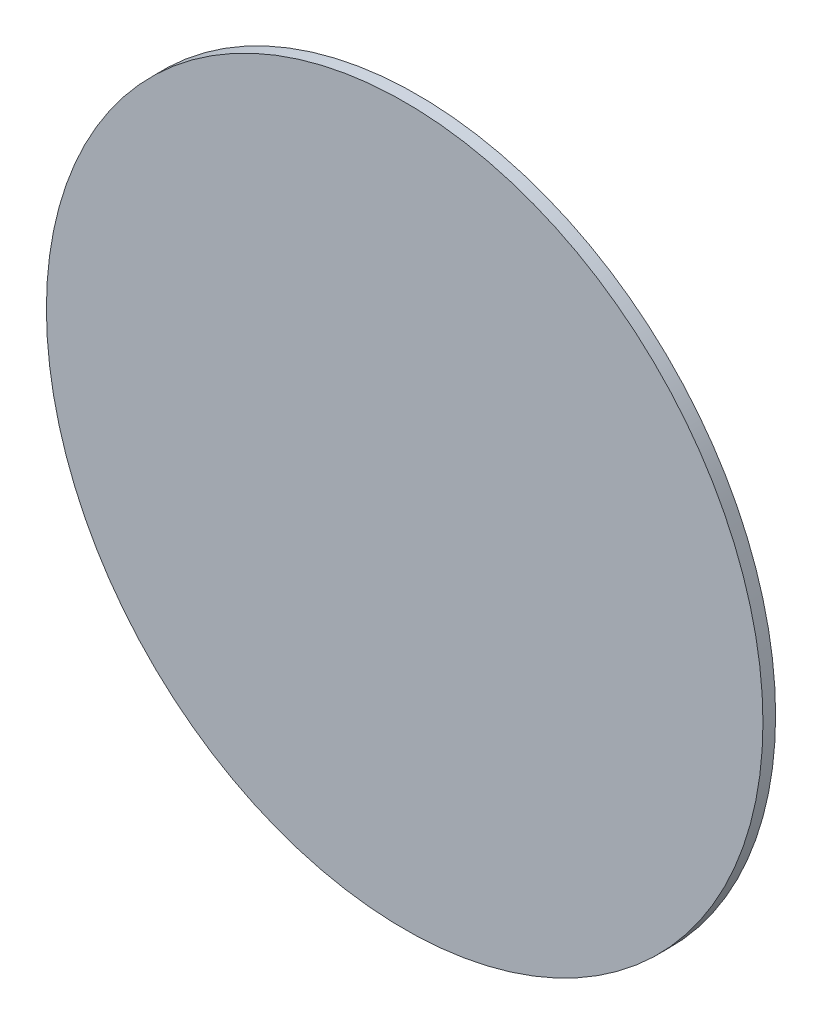
ISO-10303-21;
HEADER;
FILE_DESCRIPTION(('STEP AP214'),'2;1');
FILE_NAME('part.step','',(''),(''),'','','');
FILE_SCHEMA(('AUTOMOTIVE_DESIGN { 1 0 10303 214 1 1 1 1 }'));
ENDSEC;
DATA;
#1=APPLICATION_CONTEXT('core data for automotive mechanical design processes');
#2=APPLICATION_PROTOCOL_DEFINITION('international standard','automotive_design',2000,#1);
#3=PRODUCT_CONTEXT('',#1,'mechanical');
#4=PRODUCT('Part','Part','',(#3));
#5=PRODUCT_RELATED_PRODUCT_CATEGORY('part','',(#4));
#6=PRODUCT_DEFINITION_FORMATION('','',#4);
#7=PRODUCT_DEFINITION_CONTEXT('part definition',#1,'design');
#8=PRODUCT_DEFINITION('design','',#6,#7);
#9=PRODUCT_DEFINITION_SHAPE('','',#8);
#10=(LENGTH_UNIT() NAMED_UNIT(*) SI_UNIT(.MILLI.,.METRE.));
#11=(NAMED_UNIT(*) PLANE_ANGLE_UNIT() SI_UNIT($,.RADIAN.));
#12=(NAMED_UNIT(*) SI_UNIT($,.STERADIAN.) SOLID_ANGLE_UNIT());
#13=UNCERTAINTY_MEASURE_WITH_UNIT(LENGTH_MEASURE(1.E-05),#10,'distance_accuracy_value','');
#14=(GEOMETRIC_REPRESENTATION_CONTEXT(3) GLOBAL_UNCERTAINTY_ASSIGNED_CONTEXT((#13)) GLOBAL_UNIT_ASSIGNED_CONTEXT((#10,
#11,#12)) REPRESENTATION_CONTEXT('',''));
#15=CARTESIAN_POINT('',(0.,0.,0.));
#16=DIRECTION('',(0.,0.,1.));
#17=DIRECTION('',(1.,0.,0.));
#18=AXIS2_PLACEMENT_3D('',#15,#16,#17);
#19=CARTESIAN_POINT('',(0.,0.,1.5));
#20=DIRECTION('',(0.,0.,-1.));
#21=DIRECTION('',(-1.,0.,0.));
#22=AXIS2_PLACEMENT_3D('',#19,#20,#21);
#23=CYLINDRICAL_SURFACE('',#22,42.5);
#24=CARTESIAN_POINT('',(0.,0.,1.5));
#25=DIRECTION('',(0.,0.,1.));
#26=DIRECTION('',(1.,0.,0.));
#27=AXIS2_PLACEMENT_3D('',#24,#25,#26);
#28=CIRCLE('',#27,42.5);
#29=CARTESIAN_POINT('',(42.5,0.,1.5));
#30=VERTEX_POINT('',#29);
#31=EDGE_CURVE('E10',#30,#30,#28,.T.);
#32=ORIENTED_EDGE('',*,*,#31,.F.);
#33=EDGE_LOOP('',(#32));
#34=FACE_BOUND('',#33,.T.);
#35=CARTESIAN_POINT('',(0.,0.,0.));
#36=DIRECTION('',(0.,0.,1.));
#37=DIRECTION('',(1.,0.,0.));
#38=AXIS2_PLACEMENT_3D('',#35,#36,#37);
#39=CIRCLE('',#38,42.5);
#40=CARTESIAN_POINT('',(42.5,0.,0.));
#41=VERTEX_POINT('',#40);
#42=EDGE_CURVE('E46',#41,#41,#39,.T.);
#43=ORIENTED_EDGE('',*,*,#42,.T.);
#44=EDGE_LOOP('',(#43));
#45=FACE_BOUND('',#44,.T.);
#46=ADVANCED_FACE('F43',(#34,#45),#23,.T.);
#47=CARTESIAN_POINT('',(0.,0.,1.5));
#48=DIRECTION('',(0.,0.,1.));
#49=DIRECTION('',(1.,0.,0.));
#50=AXIS2_PLACEMENT_3D('',#47,#48,#49);
#51=PLANE('',#50);
#52=ORIENTED_EDGE('',*,*,#31,.T.);
#53=EDGE_LOOP('',(#52));
#54=FACE_BOUND('',#53,.T.);
#55=ADVANCED_FACE('F60',(#54),#51,.T.);
#56=CARTESIAN_POINT('',(0.,0.,0.));
#57=DIRECTION('',(0.,0.,1.));
#58=DIRECTION('',(1.,0.,0.));
#59=AXIS2_PLACEMENT_3D('',#56,#57,#58);
#60=PLANE('',#59);
#61=ORIENTED_EDGE('',*,*,#42,.F.);
#62=EDGE_LOOP('',(#61));
#63=FACE_BOUND('',#62,.T.);
#64=ADVANCED_FACE('F58',(#63),#60,.F.);
#65=CLOSED_SHELL('',(#46,#55,#64));
#66=MANIFOLD_SOLID_BREP('B2',#65);
#67=ADVANCED_BREP_SHAPE_REPRESENTATION('',(#18,#66),#14);
#68=SHAPE_DEFINITION_REPRESENTATION(#9,#67);
ENDSEC;
END-ISO-10303-21;
